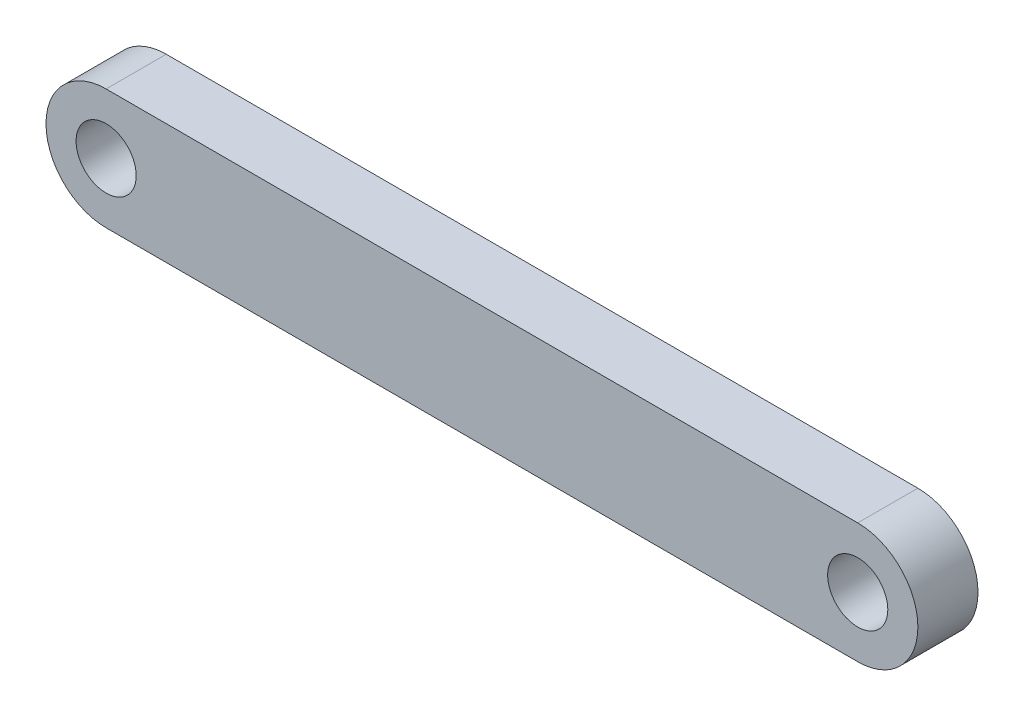
ISO-10303-21;
HEADER;
FILE_DESCRIPTION(('STEP AP214'),'2;1');
FILE_NAME('part.step','',(''),(''),'','','');
FILE_SCHEMA(('AUTOMOTIVE_DESIGN { 1 0 10303 214 1 1 1 1 }'));
ENDSEC;
DATA;
#1=APPLICATION_CONTEXT('core data for automotive mechanical design processes');
#2=APPLICATION_PROTOCOL_DEFINITION('international standard','automotive_design',2000,#1);
#3=PRODUCT_CONTEXT('',#1,'mechanical');
#4=PRODUCT('Part','Part','',(#3));
#5=PRODUCT_RELATED_PRODUCT_CATEGORY('part','',(#4));
#6=PRODUCT_DEFINITION_FORMATION('','',#4);
#7=PRODUCT_DEFINITION_CONTEXT('part definition',#1,'design');
#8=PRODUCT_DEFINITION('design','',#6,#7);
#9=PRODUCT_DEFINITION_SHAPE('','',#8);
#10=(LENGTH_UNIT() NAMED_UNIT(*) SI_UNIT(.MILLI.,.METRE.));
#11=(NAMED_UNIT(*) PLANE_ANGLE_UNIT() SI_UNIT($,.RADIAN.));
#12=(NAMED_UNIT(*) SI_UNIT($,.STERADIAN.) SOLID_ANGLE_UNIT());
#13=UNCERTAINTY_MEASURE_WITH_UNIT(LENGTH_MEASURE(1.E-05),#10,'distance_accuracy_value','');
#14=(GEOMETRIC_REPRESENTATION_CONTEXT(3) GLOBAL_UNCERTAINTY_ASSIGNED_CONTEXT((#13)) GLOBAL_UNIT_ASSIGNED_CONTEXT((#10,
#11,#12)) REPRESENTATION_CONTEXT('',''));
#15=CARTESIAN_POINT('',(0.,0.,0.));
#16=DIRECTION('',(0.,0.,1.));
#17=DIRECTION('',(1.,0.,0.));
#18=AXIS2_PLACEMENT_3D('',#15,#16,#17);
#19=CARTESIAN_POINT('',(-15.875,0.,-1.27));
#20=DIRECTION('',(0.,0.,1.));
#21=DIRECTION('',(1.,0.,0.));
#22=AXIS2_PLACEMENT_3D('',#19,#20,#21);
#23=CYLINDRICAL_SURFACE('',#22,2.54000000000001);
#24=DIRECTION('',(0.,0.,1.));
#25=VECTOR('',#24,1.);
#26=CARTESIAN_POINT('',(-15.875,-2.54000000000001,-1.27));
#27=LINE('',#26,#25);
#28=CARTESIAN_POINT('',(-15.875,-2.54000000000001,-1.27));
#29=VERTEX_POINT('',#28);
#30=CARTESIAN_POINT('',(-15.875,-2.54000000000001,1.27));
#31=VERTEX_POINT('',#30);
#32=EDGE_CURVE('E36',#29,#31,#27,.T.);
#33=ORIENTED_EDGE('',*,*,#32,.T.);
#34=CARTESIAN_POINT('',(-15.875,0.,1.27));
#35=DIRECTION('',(0.,0.,1.));
#36=DIRECTION('',(1.,0.,0.));
#37=AXIS2_PLACEMENT_3D('',#34,#35,#36);
#38=CIRCLE('',#37,2.54000000000001);
#39=CARTESIAN_POINT('',(-15.875,2.54000000000001,1.27));
#40=VERTEX_POINT('',#39);
#41=EDGE_CURVE('E73',#40,#31,#38,.T.);
#42=ORIENTED_EDGE('',*,*,#41,.F.);
#43=DIRECTION('',(0.,0.,1.));
#44=VECTOR('',#43,1.);
#45=CARTESIAN_POINT('',(-15.875,2.54000000000001,-1.27));
#46=LINE('',#45,#44);
#47=CARTESIAN_POINT('',(-15.875,2.54000000000001,-1.27));
#48=VERTEX_POINT('',#47);
#49=EDGE_CURVE('E11',#48,#40,#46,.T.);
#50=ORIENTED_EDGE('',*,*,#49,.F.);
#51=CARTESIAN_POINT('',(-15.875,0.,-1.27));
#52=DIRECTION('',(0.,0.,1.));
#53=DIRECTION('',(1.,0.,0.));
#54=AXIS2_PLACEMENT_3D('',#51,#52,#53);
#55=CIRCLE('',#54,2.54000000000001);
#56=EDGE_CURVE('E74',#48,#29,#55,.T.);
#57=ORIENTED_EDGE('',*,*,#56,.T.);
#58=EDGE_LOOP('',(#33,#42,#50,#57));
#59=FACE_BOUND('',#58,.T.);
#60=ADVANCED_FACE('F33',(#59),#23,.T.);
#61=CARTESIAN_POINT('',(-15.875,2.54000000000001,-1.27));
#62=DIRECTION('',(0.,1.,0.));
#63=DIRECTION('',(0.,0.,1.));
#64=AXIS2_PLACEMENT_3D('',#61,#62,#63);
#65=PLANE('',#64);
#66=ORIENTED_EDGE('',*,*,#49,.T.);
#67=DIRECTION('',(-1.,0.,0.));
#68=VECTOR('',#67,1.);
#69=CARTESIAN_POINT('',(-15.875,2.54000000000001,1.27));
#70=LINE('',#69,#68);
#71=CARTESIAN_POINT('',(15.875,2.54000000000001,1.27));
#72=VERTEX_POINT('',#71);
#73=EDGE_CURVE('E91',#72,#40,#70,.T.);
#74=ORIENTED_EDGE('',*,*,#73,.F.);
#75=DIRECTION('',(0.,0.,1.));
#76=VECTOR('',#75,1.);
#77=CARTESIAN_POINT('',(15.875,2.54000000000001,-1.27));
#78=LINE('',#77,#76);
#79=CARTESIAN_POINT('',(15.875,2.54000000000001,-1.27));
#80=VERTEX_POINT('',#79);
#81=EDGE_CURVE('E41',#80,#72,#78,.T.);
#82=ORIENTED_EDGE('',*,*,#81,.F.);
#83=DIRECTION('',(-1.,0.,0.));
#84=VECTOR('',#83,1.);
#85=CARTESIAN_POINT('',(-15.875,2.54000000000001,-1.27));
#86=LINE('',#85,#84);
#87=EDGE_CURVE('E79',#80,#48,#86,.T.);
#88=ORIENTED_EDGE('',*,*,#87,.T.);
#89=EDGE_LOOP('',(#66,#74,#82,#88));
#90=FACE_BOUND('',#89,.T.);
#91=ADVANCED_FACE('F117',(#90),#65,.T.);
#92=CARTESIAN_POINT('',(15.875,0.,-1.27));
#93=DIRECTION('',(0.,0.,1.));
#94=DIRECTION('',(1.,0.,0.));
#95=AXIS2_PLACEMENT_3D('',#92,#93,#94);
#96=CYLINDRICAL_SURFACE('',#95,2.54000000000001);
#97=ORIENTED_EDGE('',*,*,#81,.T.);
#98=CARTESIAN_POINT('',(15.875,0.,1.27));
#99=DIRECTION('',(0.,0.,1.));
#100=DIRECTION('',(1.,0.,0.));
#101=AXIS2_PLACEMENT_3D('',#98,#99,#100);
#102=CIRCLE('',#101,2.54000000000001);
#103=CARTESIAN_POINT('',(15.875,-2.54000000000001,1.27));
#104=VERTEX_POINT('',#103);
#105=EDGE_CURVE('E86',#104,#72,#102,.T.);
#106=ORIENTED_EDGE('',*,*,#105,.F.);
#107=DIRECTION('',(0.,0.,1.));
#108=VECTOR('',#107,1.);
#109=CARTESIAN_POINT('',(15.875,-2.54000000000001,-1.27));
#110=LINE('',#109,#108);
#111=CARTESIAN_POINT('',(15.875,-2.54000000000001,-1.27));
#112=VERTEX_POINT('',#111);
#113=EDGE_CURVE('E78',#112,#104,#110,.T.);
#114=ORIENTED_EDGE('',*,*,#113,.F.);
#115=CARTESIAN_POINT('',(15.875,0.,-1.27));
#116=DIRECTION('',(0.,0.,1.));
#117=DIRECTION('',(1.,0.,0.));
#118=AXIS2_PLACEMENT_3D('',#115,#116,#117);
#119=CIRCLE('',#118,2.54000000000001);
#120=EDGE_CURVE('E110',#112,#80,#119,.T.);
#121=ORIENTED_EDGE('',*,*,#120,.T.);
#122=EDGE_LOOP('',(#97,#106,#114,#121));
#123=FACE_BOUND('',#122,.T.);
#124=ADVANCED_FACE('F114',(#123),#96,.T.);
#125=CARTESIAN_POINT('',(-15.875,-2.54000000000001,-1.27));
#126=DIRECTION('',(0.,-1.,0.));
#127=DIRECTION('',(0.,0.,-1.));
#128=AXIS2_PLACEMENT_3D('',#125,#126,#127);
#129=PLANE('',#128);
#130=ORIENTED_EDGE('',*,*,#113,.T.);
#131=DIRECTION('',(1.,0.,0.));
#132=VECTOR('',#131,1.);
#133=CARTESIAN_POINT('',(-15.875,-2.54000000000001,1.27));
#134=LINE('',#133,#132);
#135=EDGE_CURVE('E81',#31,#104,#134,.T.);
#136=ORIENTED_EDGE('',*,*,#135,.F.);
#137=ORIENTED_EDGE('',*,*,#32,.F.);
#138=DIRECTION('',(1.,0.,0.));
#139=VECTOR('',#138,1.);
#140=CARTESIAN_POINT('',(-15.875,-2.54000000000001,-1.27));
#141=LINE('',#140,#139);
#142=EDGE_CURVE('E108',#29,#112,#141,.T.);
#143=ORIENTED_EDGE('',*,*,#142,.T.);
#144=EDGE_LOOP('',(#130,#136,#137,#143));
#145=FACE_BOUND('',#144,.T.);
#146=ADVANCED_FACE('F82',(#145),#129,.T.);
#147=CARTESIAN_POINT('',(-15.875,0.,-1.27));
#148=DIRECTION('',(0.,0.,1.));
#149=DIRECTION('',(1.,0.,0.));
#150=AXIS2_PLACEMENT_3D('',#147,#148,#149);
#151=PLANE('',#150);
#152=CARTESIAN_POINT('',(15.875,0.,-1.27));
#153=DIRECTION('',(0.,0.,1.));
#154=DIRECTION('',(1.,0.,0.));
#155=AXIS2_PLACEMENT_3D('',#152,#153,#154);
#156=CIRCLE('',#155,1.27);
#157=CARTESIAN_POINT('',(17.145,0.,-1.27));
#158=VERTEX_POINT('',#157);
#159=EDGE_CURVE('E101',#158,#158,#156,.T.);
#160=ORIENTED_EDGE('',*,*,#159,.T.);
#161=EDGE_LOOP('',(#160));
#162=FACE_BOUND('',#161,.T.);
#163=CARTESIAN_POINT('',(-15.875,0.,-1.27));
#164=DIRECTION('',(0.,0.,1.));
#165=DIRECTION('',(1.,0.,0.));
#166=AXIS2_PLACEMENT_3D('',#163,#164,#165);
#167=CIRCLE('',#166,1.27);
#168=CARTESIAN_POINT('',(-14.605,0.,-1.27));
#169=VERTEX_POINT('',#168);
#170=EDGE_CURVE('E104',#169,#169,#167,.T.);
#171=ORIENTED_EDGE('',*,*,#170,.T.);
#172=EDGE_LOOP('',(#171));
#173=FACE_BOUND('',#172,.T.);
#174=ORIENTED_EDGE('',*,*,#56,.F.);
#175=ORIENTED_EDGE('',*,*,#87,.F.);
#176=ORIENTED_EDGE('',*,*,#120,.F.);
#177=ORIENTED_EDGE('',*,*,#142,.F.);
#178=EDGE_LOOP('',(#174,#175,#176,#177));
#179=FACE_BOUND('',#178,.T.);
#180=ADVANCED_FACE('F119',(#162,#173,#179),#151,.F.);
#181=CARTESIAN_POINT('',(-15.875,0.,-1.27));
#182=DIRECTION('',(0.,0.,1.));
#183=DIRECTION('',(1.,0.,0.));
#184=AXIS2_PLACEMENT_3D('',#181,#182,#183);
#185=CYLINDRICAL_SURFACE('',#184,1.27);
#186=ORIENTED_EDGE('',*,*,#170,.F.);
#187=EDGE_LOOP('',(#186));
#188=FACE_BOUND('',#187,.T.);
#189=CARTESIAN_POINT('',(-15.875,0.,1.27));
#190=DIRECTION('',(0.,0.,1.));
#191=DIRECTION('',(1.,0.,0.));
#192=AXIS2_PLACEMENT_3D('',#189,#190,#191);
#193=CIRCLE('',#192,1.27);
#194=CARTESIAN_POINT('',(-14.605,0.,1.27));
#195=VERTEX_POINT('',#194);
#196=EDGE_CURVE('E92',#195,#195,#193,.T.);
#197=ORIENTED_EDGE('',*,*,#196,.T.);
#198=EDGE_LOOP('',(#197));
#199=FACE_BOUND('',#198,.T.);
#200=ADVANCED_FACE('F121',(#188,#199),#185,.F.);
#201=CARTESIAN_POINT('',(15.875,0.,-1.27));
#202=DIRECTION('',(0.,0.,1.));
#203=DIRECTION('',(1.,0.,0.));
#204=AXIS2_PLACEMENT_3D('',#201,#202,#203);
#205=CYLINDRICAL_SURFACE('',#204,1.27);
#206=ORIENTED_EDGE('',*,*,#159,.F.);
#207=EDGE_LOOP('',(#206));
#208=FACE_BOUND('',#207,.T.);
#209=CARTESIAN_POINT('',(15.875,0.,1.27));
#210=DIRECTION('',(0.,0.,1.));
#211=DIRECTION('',(1.,0.,0.));
#212=AXIS2_PLACEMENT_3D('',#209,#210,#211);
#213=CIRCLE('',#212,1.27);
#214=CARTESIAN_POINT('',(17.145,0.,1.27));
#215=VERTEX_POINT('',#214);
#216=EDGE_CURVE('E95',#215,#215,#213,.T.);
#217=ORIENTED_EDGE('',*,*,#216,.T.);
#218=EDGE_LOOP('',(#217));
#219=FACE_BOUND('',#218,.T.);
#220=ADVANCED_FACE('F128',(#208,#219),#205,.F.);
#221=CARTESIAN_POINT('',(-15.875,0.,1.27));
#222=DIRECTION('',(0.,0.,1.));
#223=DIRECTION('',(1.,0.,0.));
#224=AXIS2_PLACEMENT_3D('',#221,#222,#223);
#225=PLANE('',#224);
#226=ORIENTED_EDGE('',*,*,#196,.F.);
#227=EDGE_LOOP('',(#226));
#228=FACE_BOUND('',#227,.T.);
#229=ORIENTED_EDGE('',*,*,#41,.T.);
#230=ORIENTED_EDGE('',*,*,#135,.T.);
#231=ORIENTED_EDGE('',*,*,#105,.T.);
#232=ORIENTED_EDGE('',*,*,#73,.T.);
#233=EDGE_LOOP('',(#229,#230,#231,#232));
#234=FACE_BOUND('',#233,.T.);
#235=ORIENTED_EDGE('',*,*,#216,.F.);
#236=EDGE_LOOP('',(#235));
#237=FACE_BOUND('',#236,.T.);
#238=ADVANCED_FACE('F89',(#228,#234,#237),#225,.T.);
#239=CLOSED_SHELL('',(#60,#91,#124,#146,#180,#200,#220,#238));
#240=MANIFOLD_SOLID_BREP('B2',#239);
#241=ADVANCED_BREP_SHAPE_REPRESENTATION('',(#18,#240),#14);
#242=SHAPE_DEFINITION_REPRESENTATION(#9,#241);
ENDSEC;
END-ISO-10303-21;
